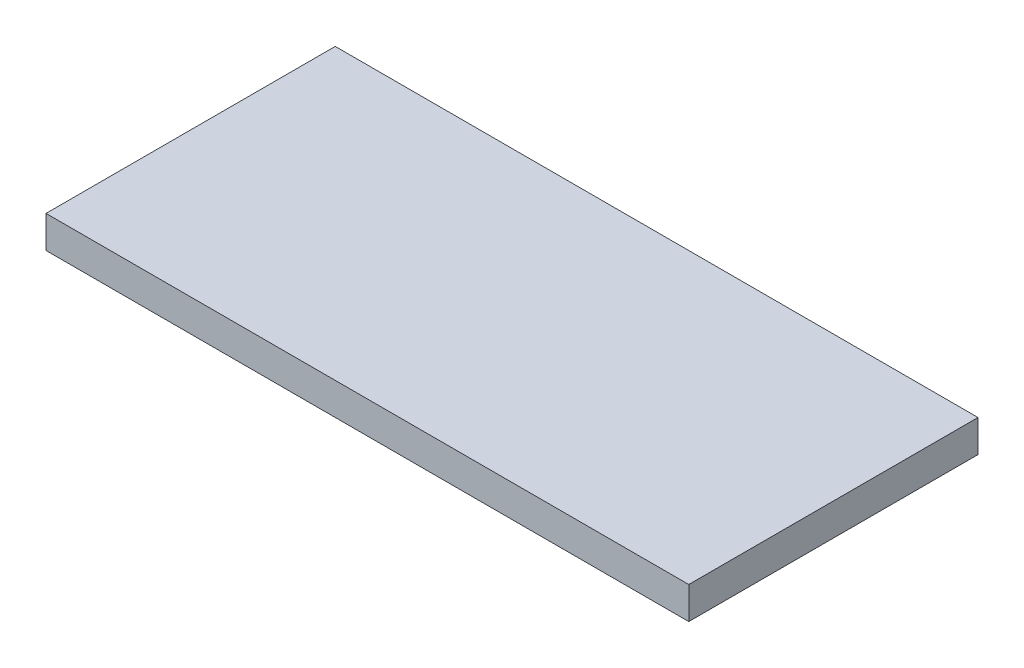
ISO-10303-21;
HEADER;
FILE_DESCRIPTION(('STEP AP214'),'2;1');
FILE_NAME('part.step','',(''),(''),'','','');
FILE_SCHEMA(('AUTOMOTIVE_DESIGN { 1 0 10303 214 1 1 1 1 }'));
ENDSEC;
DATA;
#1=APPLICATION_CONTEXT('core data for automotive mechanical design processes');
#2=APPLICATION_PROTOCOL_DEFINITION('international standard','automotive_design',2000,#1);
#3=PRODUCT_CONTEXT('',#1,'mechanical');
#4=PRODUCT('Part','Part','',(#3));
#5=PRODUCT_RELATED_PRODUCT_CATEGORY('part','',(#4));
#6=PRODUCT_DEFINITION_FORMATION('','',#4);
#7=PRODUCT_DEFINITION_CONTEXT('part definition',#1,'design');
#8=PRODUCT_DEFINITION('design','',#6,#7);
#9=PRODUCT_DEFINITION_SHAPE('','',#8);
#10=(LENGTH_UNIT() NAMED_UNIT(*) SI_UNIT(.MILLI.,.METRE.));
#11=(NAMED_UNIT(*) PLANE_ANGLE_UNIT() SI_UNIT($,.RADIAN.));
#12=(NAMED_UNIT(*) SI_UNIT($,.STERADIAN.) SOLID_ANGLE_UNIT());
#13=UNCERTAINTY_MEASURE_WITH_UNIT(LENGTH_MEASURE(1.E-05),#10,'distance_accuracy_value','');
#14=(GEOMETRIC_REPRESENTATION_CONTEXT(3) GLOBAL_UNCERTAINTY_ASSIGNED_CONTEXT((#13)) GLOBAL_UNIT_ASSIGNED_CONTEXT((#10,
#11,#12)) REPRESENTATION_CONTEXT('',''));
#15=CARTESIAN_POINT('',(0.,0.,0.));
#16=DIRECTION('',(0.,0.,1.));
#17=DIRECTION('',(1.,0.,0.));
#18=AXIS2_PLACEMENT_3D('',#15,#16,#17);
#19=CARTESIAN_POINT('',(50.,5.,-22.5));
#20=DIRECTION('',(-1.,0.,0.));
#21=DIRECTION('',(0.,0.,1.));
#22=AXIS2_PLACEMENT_3D('',#19,#20,#21);
#23=PLANE('',#22);
#24=DIRECTION('',(0.,0.,-1.));
#25=VECTOR('',#24,1.);
#26=CARTESIAN_POINT('',(50.,0.,-22.5));
#27=LINE('',#26,#25);
#28=CARTESIAN_POINT('',(50.,0.,22.5));
#29=VERTEX_POINT('',#28);
#30=CARTESIAN_POINT('',(50.,0.,-22.5));
#31=VERTEX_POINT('',#30);
#32=EDGE_CURVE('E107',#29,#31,#27,.T.);
#33=ORIENTED_EDGE('',*,*,#32,.T.);
#34=DIRECTION('',(0.,-1.,0.));
#35=VECTOR('',#34,1.);
#36=CARTESIAN_POINT('',(50.,5.,-22.5));
#37=LINE('',#36,#35);
#38=CARTESIAN_POINT('',(50.,5.,-22.5));
#39=VERTEX_POINT('',#38);
#40=EDGE_CURVE('E11',#39,#31,#37,.T.);
#41=ORIENTED_EDGE('',*,*,#40,.F.);
#42=DIRECTION('',(0.,0.,-1.));
#43=VECTOR('',#42,1.);
#44=CARTESIAN_POINT('',(50.,5.,-22.5));
#45=LINE('',#44,#43);
#46=CARTESIAN_POINT('',(50.,5.,22.5));
#47=VERTEX_POINT('',#46);
#48=EDGE_CURVE('E91',#47,#39,#45,.T.);
#49=ORIENTED_EDGE('',*,*,#48,.F.);
#50=DIRECTION('',(0.,-1.,0.));
#51=VECTOR('',#50,1.);
#52=CARTESIAN_POINT('',(50.,5.,22.5));
#53=LINE('',#52,#51);
#54=EDGE_CURVE('E103',#47,#29,#53,.T.);
#55=ORIENTED_EDGE('',*,*,#54,.T.);
#56=EDGE_LOOP('',(#33,#41,#49,#55));
#57=FACE_BOUND('',#56,.T.);
#58=ADVANCED_FACE('F39',(#57),#23,.F.);
#59=CARTESIAN_POINT('',(-50.,5.,-22.5));
#60=DIRECTION('',(0.,0.,1.));
#61=DIRECTION('',(1.,0.,0.));
#62=AXIS2_PLACEMENT_3D('',#59,#60,#61);
#63=PLANE('',#62);
#64=DIRECTION('',(-1.,0.,0.));
#65=VECTOR('',#64,1.);
#66=CARTESIAN_POINT('',(-50.,0.,-22.5));
#67=LINE('',#66,#65);
#68=CARTESIAN_POINT('',(-50.,0.,-22.5));
#69=VERTEX_POINT('',#68);
#70=EDGE_CURVE('E96',#31,#69,#67,.T.);
#71=ORIENTED_EDGE('',*,*,#70,.T.);
#72=DIRECTION('',(0.,-1.,0.));
#73=VECTOR('',#72,1.);
#74=CARTESIAN_POINT('',(-50.,5.,-22.5));
#75=LINE('',#74,#73);
#76=CARTESIAN_POINT('',(-50.,5.,-22.5));
#77=VERTEX_POINT('',#76);
#78=EDGE_CURVE('E48',#77,#69,#75,.T.);
#79=ORIENTED_EDGE('',*,*,#78,.F.);
#80=DIRECTION('',(-1.,0.,0.));
#81=VECTOR('',#80,1.);
#82=CARTESIAN_POINT('',(-50.,5.,-22.5));
#83=LINE('',#82,#81);
#84=EDGE_CURVE('E86',#39,#77,#83,.T.);
#85=ORIENTED_EDGE('',*,*,#84,.F.);
#86=ORIENTED_EDGE('',*,*,#40,.T.);
#87=EDGE_LOOP('',(#71,#79,#85,#86));
#88=FACE_BOUND('',#87,.T.);
#89=ADVANCED_FACE('F95',(#88),#63,.F.);
#90=CARTESIAN_POINT('',(-50.,5.,-22.5));
#91=DIRECTION('',(1.,0.,0.));
#92=DIRECTION('',(0.,0.,-1.));
#93=AXIS2_PLACEMENT_3D('',#90,#91,#92);
#94=PLANE('',#93);
#95=DIRECTION('',(0.,0.,1.));
#96=VECTOR('',#95,1.);
#97=CARTESIAN_POINT('',(-50.,0.,-22.5));
#98=LINE('',#97,#96);
#99=CARTESIAN_POINT('',(-50.,0.,22.5));
#100=VERTEX_POINT('',#99);
#101=EDGE_CURVE('E73',#69,#100,#98,.T.);
#102=ORIENTED_EDGE('',*,*,#101,.T.);
#103=DIRECTION('',(0.,-1.,0.));
#104=VECTOR('',#103,1.);
#105=CARTESIAN_POINT('',(-50.,5.,22.5));
#106=LINE('',#105,#104);
#107=CARTESIAN_POINT('',(-50.,5.,22.5));
#108=VERTEX_POINT('',#107);
#109=EDGE_CURVE('E98',#108,#100,#106,.T.);
#110=ORIENTED_EDGE('',*,*,#109,.F.);
#111=DIRECTION('',(0.,0.,1.));
#112=VECTOR('',#111,1.);
#113=CARTESIAN_POINT('',(-50.,5.,-22.5));
#114=LINE('',#113,#112);
#115=EDGE_CURVE('E89',#77,#108,#114,.T.);
#116=ORIENTED_EDGE('',*,*,#115,.F.);
#117=ORIENTED_EDGE('',*,*,#78,.T.);
#118=EDGE_LOOP('',(#102,#110,#116,#117));
#119=FACE_BOUND('',#118,.T.);
#120=ADVANCED_FACE('F99',(#119),#94,.F.);
#121=CARTESIAN_POINT('',(-50.,5.,22.5));
#122=DIRECTION('',(0.,0.,-1.));
#123=DIRECTION('',(-1.,0.,0.));
#124=AXIS2_PLACEMENT_3D('',#121,#122,#123);
#125=PLANE('',#124);
#126=DIRECTION('',(1.,0.,0.));
#127=VECTOR('',#126,1.);
#128=CARTESIAN_POINT('',(-50.,0.,22.5));
#129=LINE('',#128,#127);
#130=EDGE_CURVE('E79',#100,#29,#129,.T.);
#131=ORIENTED_EDGE('',*,*,#130,.T.);
#132=ORIENTED_EDGE('',*,*,#54,.F.);
#133=DIRECTION('',(1.,0.,0.));
#134=VECTOR('',#133,1.);
#135=CARTESIAN_POINT('',(-50.,5.,22.5));
#136=LINE('',#135,#134);
#137=EDGE_CURVE('E56',#108,#47,#136,.T.);
#138=ORIENTED_EDGE('',*,*,#137,.F.);
#139=ORIENTED_EDGE('',*,*,#109,.T.);
#140=EDGE_LOOP('',(#131,#132,#138,#139));
#141=FACE_BOUND('',#140,.T.);
#142=ADVANCED_FACE('F120',(#141),#125,.F.);
#143=CARTESIAN_POINT('',(0.,5.,0.));
#144=DIRECTION('',(0.,1.,0.));
#145=DIRECTION('',(0.,0.,1.));
#146=AXIS2_PLACEMENT_3D('',#143,#144,#145);
#147=PLANE('',#146);
#148=ORIENTED_EDGE('',*,*,#48,.T.);
#149=ORIENTED_EDGE('',*,*,#84,.T.);
#150=ORIENTED_EDGE('',*,*,#115,.T.);
#151=ORIENTED_EDGE('',*,*,#137,.T.);
#152=EDGE_LOOP('',(#148,#149,#150,#151));
#153=FACE_BOUND('',#152,.T.);
#154=ADVANCED_FACE('F87',(#153),#147,.T.);
#155=CARTESIAN_POINT('',(0.,0.,0.));
#156=DIRECTION('',(0.,1.,0.));
#157=DIRECTION('',(0.,0.,1.));
#158=AXIS2_PLACEMENT_3D('',#155,#156,#157);
#159=PLANE('',#158);
#160=ORIENTED_EDGE('',*,*,#32,.F.);
#161=ORIENTED_EDGE('',*,*,#130,.F.);
#162=ORIENTED_EDGE('',*,*,#101,.F.);
#163=ORIENTED_EDGE('',*,*,#70,.F.);
#164=EDGE_LOOP('',(#160,#161,#162,#163));
#165=FACE_BOUND('',#164,.T.);
#166=ADVANCED_FACE('F123',(#165),#159,.F.);
#167=CLOSED_SHELL('',(#58,#89,#120,#142,#154,#166));
#168=MANIFOLD_SOLID_BREP('B2',#167);
#169=ADVANCED_BREP_SHAPE_REPRESENTATION('',(#18,#168),#14);
#170=SHAPE_DEFINITION_REPRESENTATION(#9,#169);
ENDSEC;
END-ISO-10303-21;
